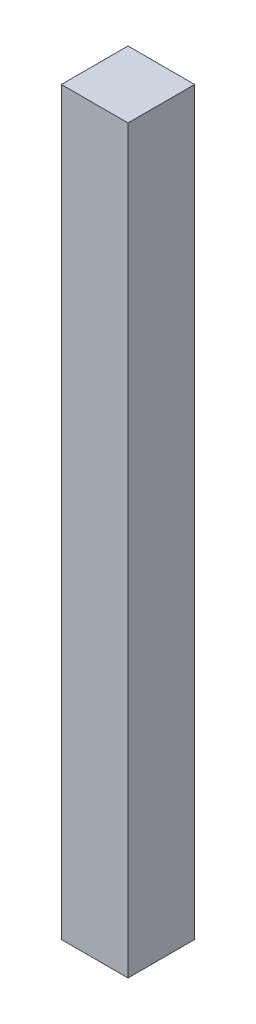
ISO-10303-21;
HEADER;
FILE_DESCRIPTION(('STEP AP214'),'2;1');
FILE_NAME('part.step','',(''),(''),'','','');
FILE_SCHEMA(('AUTOMOTIVE_DESIGN { 1 0 10303 214 1 1 1 1 }'));
ENDSEC;
DATA;
#1=APPLICATION_CONTEXT('core data for automotive mechanical design processes');
#2=APPLICATION_PROTOCOL_DEFINITION('international standard','automotive_design',2000,#1);
#3=PRODUCT_CONTEXT('',#1,'mechanical');
#4=PRODUCT('Part','Part','',(#3));
#5=PRODUCT_RELATED_PRODUCT_CATEGORY('part','',(#4));
#6=PRODUCT_DEFINITION_FORMATION('','',#4);
#7=PRODUCT_DEFINITION_CONTEXT('part definition',#1,'design');
#8=PRODUCT_DEFINITION('design','',#6,#7);
#9=PRODUCT_DEFINITION_SHAPE('','',#8);
#10=(LENGTH_UNIT() NAMED_UNIT(*) SI_UNIT(.MILLI.,.METRE.));
#11=(NAMED_UNIT(*) PLANE_ANGLE_UNIT() SI_UNIT($,.RADIAN.));
#12=(NAMED_UNIT(*) SI_UNIT($,.STERADIAN.) SOLID_ANGLE_UNIT());
#13=UNCERTAINTY_MEASURE_WITH_UNIT(LENGTH_MEASURE(1.E-05),#10,'distance_accuracy_value','');
#14=(GEOMETRIC_REPRESENTATION_CONTEXT(3) GLOBAL_UNCERTAINTY_ASSIGNED_CONTEXT((#13)) GLOBAL_UNIT_ASSIGNED_CONTEXT((#10,
#11,#12)) REPRESENTATION_CONTEXT('',''));
#15=CARTESIAN_POINT('',(0.,0.,0.));
#16=DIRECTION('',(0.,0.,1.));
#17=DIRECTION('',(1.,0.,0.));
#18=AXIS2_PLACEMENT_3D('',#15,#16,#17);
#19=CARTESIAN_POINT('',(45.,770.,26.));
#20=DIRECTION('',(1.,0.,0.));
#21=DIRECTION('',(0.,0.,-1.));
#22=AXIS2_PLACEMENT_3D('',#19,#20,#21);
#23=PLANE('',#22);
#24=DIRECTION('',(0.,-1.,0.));
#25=VECTOR('',#24,1.);
#26=CARTESIAN_POINT('',(45.,770.,8.));
#27=LINE('',#26,#25);
#28=CARTESIAN_POINT('',(45.,970.,8.));
#29=VERTEX_POINT('',#28);
#30=CARTESIAN_POINT('',(45.,770.,8.));
#31=VERTEX_POINT('',#30);
#32=EDGE_CURVE('E102',#29,#31,#27,.T.);
#33=ORIENTED_EDGE('',*,*,#32,.T.);
#34=DIRECTION('',(0.,0.,-1.));
#35=VECTOR('',#34,1.);
#36=CARTESIAN_POINT('',(45.,770.,26.));
#37=LINE('',#36,#35);
#38=CARTESIAN_POINT('',(45.,770.,26.));
#39=VERTEX_POINT('',#38);
#40=EDGE_CURVE('E11',#39,#31,#37,.T.);
#41=ORIENTED_EDGE('',*,*,#40,.F.);
#42=DIRECTION('',(0.,-1.,0.));
#43=VECTOR('',#42,1.);
#44=CARTESIAN_POINT('',(45.,770.,26.));
#45=LINE('',#44,#43);
#46=CARTESIAN_POINT('',(45.,970.,26.));
#47=VERTEX_POINT('',#46);
#48=EDGE_CURVE('E90',#47,#39,#45,.T.);
#49=ORIENTED_EDGE('',*,*,#48,.F.);
#50=DIRECTION('',(0.,0.,-1.));
#51=VECTOR('',#50,1.);
#52=CARTESIAN_POINT('',(45.,970.,26.));
#53=LINE('',#52,#51);
#54=EDGE_CURVE('E98',#47,#29,#53,.T.);
#55=ORIENTED_EDGE('',*,*,#54,.T.);
#56=EDGE_LOOP('',(#33,#41,#49,#55));
#57=FACE_BOUND('',#56,.T.);
#58=ADVANCED_FACE('F39',(#57),#23,.F.);
#59=CARTESIAN_POINT('',(45.,770.,26.));
#60=DIRECTION('',(0.,1.,0.));
#61=DIRECTION('',(0.,0.,1.));
#62=AXIS2_PLACEMENT_3D('',#59,#60,#61);
#63=PLANE('',#62);
#64=DIRECTION('',(1.,0.,0.));
#65=VECTOR('',#64,1.);
#66=CARTESIAN_POINT('',(45.,770.,8.));
#67=LINE('',#66,#65);
#68=CARTESIAN_POINT('',(63.,770.,8.));
#69=VERTEX_POINT('',#68);
#70=EDGE_CURVE('E94',#31,#69,#67,.T.);
#71=ORIENTED_EDGE('',*,*,#70,.T.);
#72=DIRECTION('',(0.,0.,-1.));
#73=VECTOR('',#72,1.);
#74=CARTESIAN_POINT('',(63.,770.,26.));
#75=LINE('',#74,#73);
#76=CARTESIAN_POINT('',(63.,770.,26.));
#77=VERTEX_POINT('',#76);
#78=EDGE_CURVE('E47',#77,#69,#75,.T.);
#79=ORIENTED_EDGE('',*,*,#78,.F.);
#80=DIRECTION('',(1.,0.,0.));
#81=VECTOR('',#80,1.);
#82=CARTESIAN_POINT('',(45.,770.,26.));
#83=LINE('',#82,#81);
#84=EDGE_CURVE('E85',#39,#77,#83,.T.);
#85=ORIENTED_EDGE('',*,*,#84,.F.);
#86=ORIENTED_EDGE('',*,*,#40,.T.);
#87=EDGE_LOOP('',(#71,#79,#85,#86));
#88=FACE_BOUND('',#87,.T.);
#89=ADVANCED_FACE('F93',(#88),#63,.F.);
#90=CARTESIAN_POINT('',(63.,770.,26.));
#91=DIRECTION('',(-1.,0.,0.));
#92=DIRECTION('',(0.,0.,1.));
#93=AXIS2_PLACEMENT_3D('',#90,#91,#92);
#94=PLANE('',#93);
#95=DIRECTION('',(0.,1.,0.));
#96=VECTOR('',#95,1.);
#97=CARTESIAN_POINT('',(63.,770.,8.));
#98=LINE('',#97,#96);
#99=CARTESIAN_POINT('',(63.,970.,8.));
#100=VERTEX_POINT('',#99);
#101=EDGE_CURVE('E72',#69,#100,#98,.T.);
#102=ORIENTED_EDGE('',*,*,#101,.T.);
#103=DIRECTION('',(0.,0.,-1.));
#104=VECTOR('',#103,1.);
#105=CARTESIAN_POINT('',(63.,970.,26.));
#106=LINE('',#105,#104);
#107=CARTESIAN_POINT('',(63.,970.,26.));
#108=VERTEX_POINT('',#107);
#109=EDGE_CURVE('E95',#108,#100,#106,.T.);
#110=ORIENTED_EDGE('',*,*,#109,.F.);
#111=DIRECTION('',(0.,1.,0.));
#112=VECTOR('',#111,1.);
#113=CARTESIAN_POINT('',(63.,770.,26.));
#114=LINE('',#113,#112);
#115=EDGE_CURVE('E88',#77,#108,#114,.T.);
#116=ORIENTED_EDGE('',*,*,#115,.F.);
#117=ORIENTED_EDGE('',*,*,#78,.T.);
#118=EDGE_LOOP('',(#102,#110,#116,#117));
#119=FACE_BOUND('',#118,.T.);
#120=ADVANCED_FACE('F96',(#119),#94,.F.);
#121=CARTESIAN_POINT('',(45.,970.,26.));
#122=DIRECTION('',(0.,-1.,0.));
#123=DIRECTION('',(0.,0.,-1.));
#124=AXIS2_PLACEMENT_3D('',#121,#122,#123);
#125=PLANE('',#124);
#126=DIRECTION('',(-1.,0.,0.));
#127=VECTOR('',#126,1.);
#128=CARTESIAN_POINT('',(45.,970.,8.));
#129=LINE('',#128,#127);
#130=EDGE_CURVE('E78',#100,#29,#129,.T.);
#131=ORIENTED_EDGE('',*,*,#130,.T.);
#132=ORIENTED_EDGE('',*,*,#54,.F.);
#133=DIRECTION('',(-1.,0.,0.));
#134=VECTOR('',#133,1.);
#135=CARTESIAN_POINT('',(45.,970.,26.));
#136=LINE('',#135,#134);
#137=EDGE_CURVE('E55',#108,#47,#136,.T.);
#138=ORIENTED_EDGE('',*,*,#137,.F.);
#139=ORIENTED_EDGE('',*,*,#109,.T.);
#140=EDGE_LOOP('',(#131,#132,#138,#139));
#141=FACE_BOUND('',#140,.T.);
#142=ADVANCED_FACE('F109',(#141),#125,.F.);
#143=CARTESIAN_POINT('',(0.,0.,26.));
#144=DIRECTION('',(0.,0.,-1.));
#145=DIRECTION('',(-1.,0.,0.));
#146=AXIS2_PLACEMENT_3D('',#143,#144,#145);
#147=PLANE('',#146);
#148=ORIENTED_EDGE('',*,*,#48,.T.);
#149=ORIENTED_EDGE('',*,*,#84,.T.);
#150=ORIENTED_EDGE('',*,*,#115,.T.);
#151=ORIENTED_EDGE('',*,*,#137,.T.);
#152=EDGE_LOOP('',(#148,#149,#150,#151));
#153=FACE_BOUND('',#152,.T.);
#154=ADVANCED_FACE('F86',(#153),#147,.F.);
#155=CARTESIAN_POINT('',(0.,0.,8.));
#156=DIRECTION('',(0.,0.,-1.));
#157=DIRECTION('',(-1.,0.,0.));
#158=AXIS2_PLACEMENT_3D('',#155,#156,#157);
#159=PLANE('',#158);
#160=ORIENTED_EDGE('',*,*,#32,.F.);
#161=ORIENTED_EDGE('',*,*,#130,.F.);
#162=ORIENTED_EDGE('',*,*,#101,.F.);
#163=ORIENTED_EDGE('',*,*,#70,.F.);
#164=EDGE_LOOP('',(#160,#161,#162,#163));
#165=FACE_BOUND('',#164,.T.);
#166=ADVANCED_FACE('F112',(#165),#159,.T.);
#167=CLOSED_SHELL('',(#58,#89,#120,#142,#154,#166));
#168=MANIFOLD_SOLID_BREP('B2',#167);
#169=ADVANCED_BREP_SHAPE_REPRESENTATION('',(#18,#168),#14);
#170=SHAPE_DEFINITION_REPRESENTATION(#9,#169);
ENDSEC;
END-ISO-10303-21;
